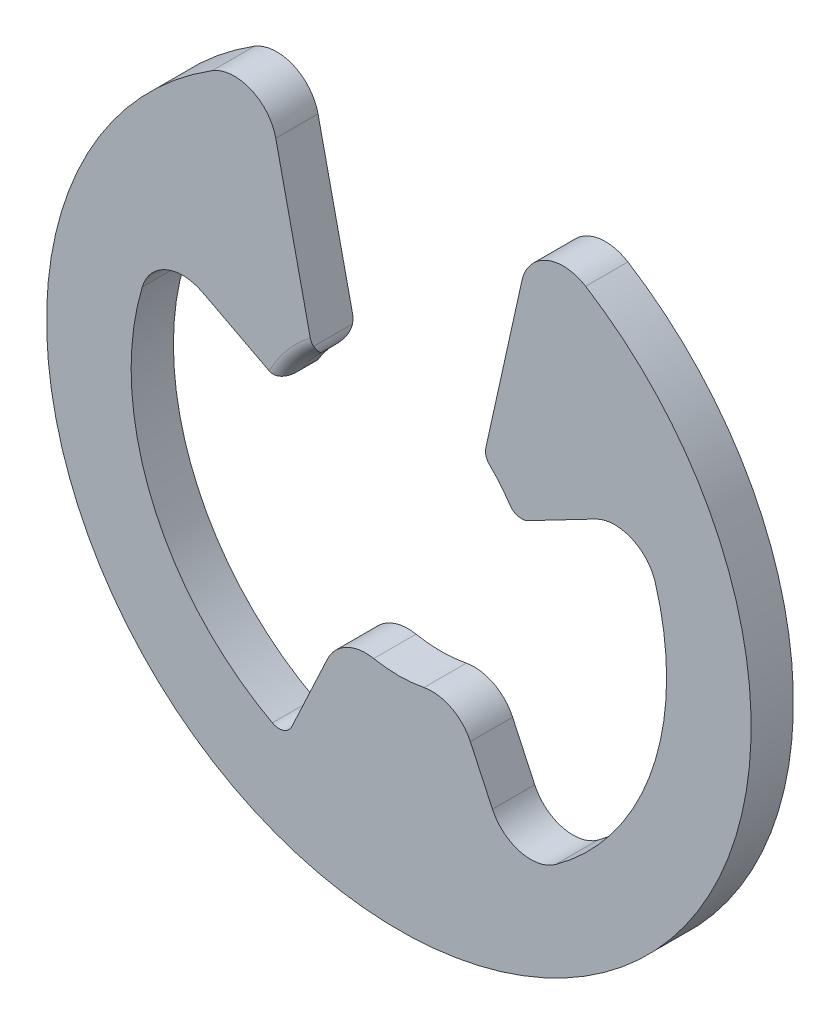
ISO-10303-21;
HEADER;
FILE_DESCRIPTION(('STEP AP214'),'2;1');
FILE_NAME('part.step','',(''),(''),'','','');
FILE_SCHEMA(('AUTOMOTIVE_DESIGN { 1 0 10303 214 1 1 1 1 }'));
ENDSEC;
DATA;
#1=APPLICATION_CONTEXT('core data for automotive mechanical design processes');
#2=APPLICATION_PROTOCOL_DEFINITION('international standard','automotive_design',2000,#1);
#3=PRODUCT_CONTEXT('',#1,'mechanical');
#4=PRODUCT('Part','Part','',(#3));
#5=PRODUCT_RELATED_PRODUCT_CATEGORY('part','',(#4));
#6=PRODUCT_DEFINITION_FORMATION('','',#4);
#7=PRODUCT_DEFINITION_CONTEXT('part definition',#1,'design');
#8=PRODUCT_DEFINITION('design','',#6,#7);
#9=PRODUCT_DEFINITION_SHAPE('','',#8);
#10=(LENGTH_UNIT() NAMED_UNIT(*) SI_UNIT(.MILLI.,.METRE.));
#11=(NAMED_UNIT(*) PLANE_ANGLE_UNIT() SI_UNIT($,.RADIAN.));
#12=(NAMED_UNIT(*) SI_UNIT($,.STERADIAN.) SOLID_ANGLE_UNIT());
#13=UNCERTAINTY_MEASURE_WITH_UNIT(LENGTH_MEASURE(1.E-05),#10,'distance_accuracy_value','');
#14=(GEOMETRIC_REPRESENTATION_CONTEXT(3) GLOBAL_UNCERTAINTY_ASSIGNED_CONTEXT((#13)) GLOBAL_UNIT_ASSIGNED_CONTEXT((#10,
#11,#12)) REPRESENTATION_CONTEXT('',''));
#15=CARTESIAN_POINT('',(0.,0.,0.));
#16=DIRECTION('',(0.,0.,1.));
#17=DIRECTION('',(1.,0.,0.));
#18=AXIS2_PLACEMENT_3D('',#15,#16,#17);
#19=CARTESIAN_POINT('',(0.,0.,0.1905));
#20=DIRECTION('',(0.,0.,1.));
#21=DIRECTION('',(1.,0.,0.));
#22=AXIS2_PLACEMENT_3D('',#19,#20,#21);
#23=PLANE('',#22);
#24=DIRECTION('',(0.216439613938083,0.976296007119938,0.));
#25=VECTOR('',#24,1.);
#26=CARTESIAN_POINT('',(0.635,0.31070010017431,0.1905));
#27=LINE('',#26,#25);
#28=CARTESIAN_POINT('',(0.783751123944975,0.981673059882263,0.1905));
#29=VERTEX_POINT('',#28);
#30=CARTESIAN_POINT('',(1.10956464167249,2.45132286490398,0.1905));
#31=VERTEX_POINT('',#30);
#32=EDGE_CURVE('E562',#29,#31,#27,.T.);
#33=ORIENTED_EDGE('',*,*,#32,.F.);
#34=CARTESIAN_POINT('',(0.907740716849207,0.954185228912126,0.1905));
#35=DIRECTION('',(0.,0.,1.));
#36=DIRECTION('',(1.,0.,0.));
#37=AXIS2_PLACEMENT_3D('',#34,#35,#36);
#38=CIRCLE('',#37,0.127);
#39=CARTESIAN_POINT('',(0.820205450036362,0.862171224195432,0.1905));
#40=VERTEX_POINT('',#39);
#41=EDGE_CURVE('E248',#29,#40,#38,.T.);
#42=ORIENTED_EDGE('',*,*,#41,.T.);
#43=CARTESIAN_POINT('',(0.,0.,0.1905));
#44=DIRECTION('',(0.,0.,1.));
#45=DIRECTION('',(1.,0.,0.));
#46=AXIS2_PLACEMENT_3D('',#43,#44,#45);
#47=CIRCLE('',#46,1.18999);
#48=CARTESIAN_POINT('',(0.998813518757322,0.646875378142975,0.1905));
#49=VERTEX_POINT('',#48);
#50=EDGE_CURVE('E574',#49,#40,#47,.T.);
#51=ORIENTED_EDGE('',*,*,#50,.F.);
#52=CARTESIAN_POINT('',(1.10541047913697,0.715912238136889,0.1905));
#53=DIRECTION('',(0.,0.,1.));
#54=DIRECTION('',(1.,0.,0.));
#55=AXIS2_PLACEMENT_3D('',#52,#53,#54);
#56=CIRCLE('',#55,0.127);
#57=CARTESIAN_POINT('',(1.16405255301782,0.603261862323256,0.1905));
#58=VERTEX_POINT('',#57);
#59=EDGE_CURVE('E271',#49,#58,#56,.T.);
#60=ORIENTED_EDGE('',*,*,#59,.T.);
#61=DIRECTION('',(-0.887010833178209,-0.461748613235057,0.));
#62=VECTOR('',#61,1.);
#63=CARTESIAN_POINT('',(0.00110812508443814,-0.00212868848165393,0.1905));
#64=LINE('',#63,#62);
#65=CARTESIAN_POINT('',(1.77114008936247,0.919291630544937,0.1905));
#66=VERTEX_POINT('',#65);
#67=EDGE_CURVE('E538',#66,#58,#64,.T.);
#68=ORIENTED_EDGE('',*,*,#67,.F.);
#69=CARTESIAN_POINT('',(1.94706631100503,0.581340503104039,0.1905));
#70=DIRECTION('',(0.,0.,1.));
#71=DIRECTION('',(1.,0.,0.));
#72=AXIS2_PLACEMENT_3D('',#69,#70,#71);
#73=CIRCLE('',#72,0.381);
#74=CARTESIAN_POINT('',(2.31214124431847,0.690341847436047,0.1905));
#75=VERTEX_POINT('',#74);
#76=EDGE_CURVE('E517',#66,#75,#73,.F.);
#77=ORIENTED_EDGE('',*,*,#76,.T.);
#78=CARTESIAN_POINT('',(0.,0.,0.1905));
#79=DIRECTION('',(0.,0.,1.));
#80=DIRECTION('',(1.,0.,0.));
#81=AXIS2_PLACEMENT_3D('',#78,#79,#80);
#82=CIRCLE('',#81,2.413);
#83=CARTESIAN_POINT('',(1.4117485190964,-1.95691980388291,0.1905));
#84=VERTEX_POINT('',#83);
#85=EDGE_CURVE('E529',#84,#75,#82,.T.);
#86=ORIENTED_EDGE('',*,*,#85,.F.);
#87=CARTESIAN_POINT('',(1.18884085818644,-1.64793246642771,0.1905));
#88=DIRECTION('',(0.,0.,1.));
#89=DIRECTION('',(1.,0.,0.));
#90=AXIS2_PLACEMENT_3D('',#87,#88,#89);
#91=CIRCLE('',#90,0.381);
#92=CARTESIAN_POINT('',(0.843537591325478,-1.80895002415092,0.1905));
#93=VERTEX_POINT('',#92);
#94=EDGE_CURVE('E56',#84,#93,#91,.F.);
#95=ORIENTED_EDGE('',*,*,#94,.T.);
#96=DIRECTION('',(0.4226182617407,-0.90630778703665,0.));
#97=VECTOR('',#96,1.);
#98=CARTESIAN_POINT('',(8.49472678472959E-06,3.9611561536538E-06,0.1905));
#99=LINE('',#98,#97);
#100=CARTESIAN_POINT('',(0.644117509127735,-1.38129227778927,0.1905));
#101=VERTEX_POINT('',#100);
#102=EDGE_CURVE('E527',#101,#93,#99,.T.);
#103=ORIENTED_EDGE('',*,*,#102,.F.);
#104=CARTESIAN_POINT('',(0.298814242266771,-1.54230983551248,0.1905));
#105=DIRECTION('',(0.,0.,1.));
#106=DIRECTION('',(1.,0.,0.));
#107=AXIS2_PLACEMENT_3D('',#104,#105,#106);
#108=CIRCLE('',#107,0.381);
#109=CARTESIAN_POINT('',(0.226345145516544,-1.16826541299531,0.1905));
#110=VERTEX_POINT('',#109);
#111=EDGE_CURVE('E262',#101,#110,#108,.T.);
#112=ORIENTED_EDGE('',*,*,#111,.T.);
#113=CARTESIAN_POINT('',(-0.226345145516544,-1.16826541299531,0.1905));
#114=VERTEX_POINT('',#113);
#115=EDGE_CURVE('E569',#114,#110,#47,.T.);
#116=ORIENTED_EDGE('',*,*,#115,.F.);
#117=CARTESIAN_POINT('',(-0.298814242266771,-1.54230983551248,0.1905));
#118=DIRECTION('',(0.,0.,1.));
#119=DIRECTION('',(1.,0.,0.));
#120=AXIS2_PLACEMENT_3D('',#117,#118,#119);
#121=CIRCLE('',#120,0.381);
#122=CARTESIAN_POINT('',(-0.644117509127735,-1.38129227778927,0.1905));
#123=VERTEX_POINT('',#122);
#124=EDGE_CURVE('E265',#114,#123,#121,.T.);
#125=ORIENTED_EDGE('',*,*,#124,.T.);
#126=DIRECTION('',(-0.4226182617407,-0.90630778703665,0.));
#127=VECTOR('',#126,1.);
#128=CARTESIAN_POINT('',(-0.50292,-1.07849324230614,0.1905));
#129=LINE('',#128,#127);
#130=CARTESIAN_POINT('',(-0.964621565173909,-2.06861544403168,0.1905));
#131=VERTEX_POINT('',#130);
#132=EDGE_CURVE('E537',#123,#131,#129,.T.);
#133=ORIENTED_EDGE('',*,*,#132,.T.);
#134=CARTESIAN_POINT('',(-1.07972265412756,-2.01494292479061,0.1905));
#135=DIRECTION('',(0.,0.,1.));
#136=DIRECTION('',(1.,0.,0.));
#137=AXIS2_PLACEMENT_3D('',#134,#135,#136);
#138=CIRCLE('',#137,0.127);
#139=CARTESIAN_POINT('',(-1.13970724602354,-2.12688419839009,0.1905));
#140=VERTEX_POINT('',#139);
#141=EDGE_CURVE('E505',#131,#140,#138,.F.);
#142=ORIENTED_EDGE('',*,*,#141,.T.);
#143=CARTESIAN_POINT('',(0.,0.,0.1905));
#144=DIRECTION('',(0.,0.,1.));
#145=DIRECTION('',(1.,0.,0.));
#146=AXIS2_PLACEMENT_3D('',#143,#144,#145);
#147=CIRCLE('',#146,2.413);
#148=CARTESIAN_POINT('',(-2.31214124431847,0.690341847436047,0.1905));
#149=VERTEX_POINT('',#148);
#150=EDGE_CURVE('E565',#149,#140,#147,.T.);
#151=ORIENTED_EDGE('',*,*,#150,.F.);
#152=CARTESIAN_POINT('',(-1.94706631100503,0.581340503104039,0.1905));
#153=DIRECTION('',(0.,0.,1.));
#154=DIRECTION('',(1.,0.,0.));
#155=AXIS2_PLACEMENT_3D('',#152,#153,#154);
#156=CIRCLE('',#155,0.381);
#157=CARTESIAN_POINT('',(-1.77114008936247,0.919291630544937,0.1905));
#158=VERTEX_POINT('',#157);
#159=EDGE_CURVE('E511',#149,#158,#156,.F.);
#160=ORIENTED_EDGE('',*,*,#159,.T.);
#161=DIRECTION('',(0.88701083317821,-0.461748613235058,0.));
#162=VECTOR('',#161,1.);
#163=CARTESIAN_POINT('',(-2.14146420700148,1.11207016421246,0.1905));
#164=LINE('',#163,#162);
#165=CARTESIAN_POINT('',(-1.16929058280128,0.605988608038333,0.1905));
#166=VERTEX_POINT('',#165);
#167=EDGE_CURVE('E587',#158,#166,#164,.T.);
#168=ORIENTED_EDGE('',*,*,#167,.T.);
#169=CARTESIAN_POINT('',(0.,0.,0.1905));
#170=DIRECTION('',(0.,0.,1.));
#171=DIRECTION('',(1.,0.,0.));
#172=AXIS2_PLACEMENT_3D('',#169,#170,#171);
#173=CIRCLE('',#172,1.31699);
#174=CARTESIAN_POINT('',(-0.798331234407467,1.04743968812977,0.1905));
#175=VERTEX_POINT('',#174);
#176=EDGE_CURVE('E268',#166,#175,#173,.F.);
#177=ORIENTED_EDGE('',*,*,#176,.T.);
#178=DIRECTION('',(0.216439613938083,-0.976296007119938,0.));
#179=VECTOR('',#178,1.);
#180=CARTESIAN_POINT('',(-1.27,3.175,0.1905));
#181=LINE('',#180,#179);
#182=CARTESIAN_POINT('',(-1.10956464167249,2.45132286490398,0.1905));
#183=VERTEX_POINT('',#182);
#184=EDGE_CURVE('E245',#183,#175,#181,.T.);
#185=ORIENTED_EDGE('',*,*,#184,.F.);
#186=CARTESIAN_POINT('',(-1.48153342038519,2.36885937199357,0.1905));
#187=DIRECTION('',(0.,0.,1.));
#188=DIRECTION('',(1.,0.,0.));
#189=AXIS2_PLACEMENT_3D('',#186,#187,#188);
#190=CIRCLE('',#189,0.381);
#191=CARTESIAN_POINT('',(-1.68356070498317,2.69188564999269,0.1905));
#192=VERTEX_POINT('',#191);
#193=EDGE_CURVE('E250',#183,#192,#190,.T.);
#194=ORIENTED_EDGE('',*,*,#193,.T.);
#195=CARTESIAN_POINT('',(0.,0.,0.1905));
#196=DIRECTION('',(0.,0.,1.));
#197=DIRECTION('',(1.,0.,0.));
#198=AXIS2_PLACEMENT_3D('',#195,#196,#197);
#199=CIRCLE('',#198,3.175);
#200=CARTESIAN_POINT('',(1.68356070498317,2.69188564999269,0.1905));
#201=VERTEX_POINT('',#200);
#202=EDGE_CURVE('E256',#192,#201,#199,.T.);
#203=ORIENTED_EDGE('',*,*,#202,.T.);
#204=CARTESIAN_POINT('',(1.48153342038519,2.36885937199357,0.1905));
#205=DIRECTION('',(0.,0.,1.));
#206=DIRECTION('',(1.,0.,0.));
#207=AXIS2_PLACEMENT_3D('',#204,#205,#206);
#208=CIRCLE('',#207,0.381);
#209=EDGE_CURVE('E254',#201,#31,#208,.T.);
#210=ORIENTED_EDGE('',*,*,#209,.T.);
#211=EDGE_LOOP('',(#33,#42,#51,#60,#68,#77,#86,#95,#103,#112,#116,#125,#133,#142,#151,#160,#168,
#177,#185,#194,#203,#210));
#212=FACE_BOUND('',#211,.T.);
#213=ADVANCED_FACE('F40',(#212),#23,.T.);
#214=CARTESIAN_POINT('',(0.,0.,-0.1905));
#215=DIRECTION('',(0.,0.,1.));
#216=DIRECTION('',(1.,0.,0.));
#217=AXIS2_PLACEMENT_3D('',#214,#215,#216);
#218=PLANE('',#217);
#219=CARTESIAN_POINT('',(0.,0.,-0.1905));
#220=DIRECTION('',(0.,0.,1.));
#221=DIRECTION('',(1.,0.,0.));
#222=AXIS2_PLACEMENT_3D('',#219,#220,#221);
#223=CIRCLE('',#222,1.18999);
#224=CARTESIAN_POINT('',(0.998813518757322,0.646875378142975,-0.1905));
#225=VERTEX_POINT('',#224);
#226=CARTESIAN_POINT('',(0.820205450036362,0.862171224195432,-0.1905));
#227=VERTEX_POINT('',#226);
#228=EDGE_CURVE('E227',#225,#227,#223,.T.);
#229=ORIENTED_EDGE('',*,*,#228,.T.);
#230=CARTESIAN_POINT('',(0.907740716849207,0.954185228912126,-0.1905));
#231=DIRECTION('',(0.,0.,1.));
#232=DIRECTION('',(1.,0.,0.));
#233=AXIS2_PLACEMENT_3D('',#230,#231,#232);
#234=CIRCLE('',#233,0.127);
#235=CARTESIAN_POINT('',(0.783751123944975,0.981673059882263,-0.1905));
#236=VERTEX_POINT('',#235);
#237=EDGE_CURVE('E221',#227,#236,#234,.F.);
#238=ORIENTED_EDGE('',*,*,#237,.T.);
#239=DIRECTION('',(0.216439613938083,0.976296007119938,0.));
#240=VECTOR('',#239,1.);
#241=CARTESIAN_POINT('',(0.635,0.31070010017431,-0.1905));
#242=LINE('',#241,#240);
#243=CARTESIAN_POINT('',(1.10956464167249,2.45132286490398,-0.1905));
#244=VERTEX_POINT('',#243);
#245=EDGE_CURVE('E224',#236,#244,#242,.T.);
#246=ORIENTED_EDGE('',*,*,#245,.T.);
#247=CARTESIAN_POINT('',(1.48153342038519,2.36885937199357,-0.1905));
#248=DIRECTION('',(0.,0.,1.));
#249=DIRECTION('',(1.,0.,0.));
#250=AXIS2_PLACEMENT_3D('',#247,#248,#249);
#251=CIRCLE('',#250,0.381);
#252=CARTESIAN_POINT('',(1.68356070498317,2.69188564999269,-0.1905));
#253=VERTEX_POINT('',#252);
#254=EDGE_CURVE('E286',#244,#253,#251,.F.);
#255=ORIENTED_EDGE('',*,*,#254,.T.);
#256=CARTESIAN_POINT('',(0.,0.,-0.1905));
#257=DIRECTION('',(0.,0.,1.));
#258=DIRECTION('',(1.,0.,0.));
#259=AXIS2_PLACEMENT_3D('',#256,#257,#258);
#260=CIRCLE('',#259,3.175);
#261=CARTESIAN_POINT('',(-1.68356070498317,2.69188564999269,-0.1905));
#262=VERTEX_POINT('',#261);
#263=EDGE_CURVE('E573',#262,#253,#260,.T.);
#264=ORIENTED_EDGE('',*,*,#263,.F.);
#265=CARTESIAN_POINT('',(-1.48153342038519,2.36885937199357,-0.1905));
#266=DIRECTION('',(0.,0.,1.));
#267=DIRECTION('',(1.,0.,0.));
#268=AXIS2_PLACEMENT_3D('',#265,#266,#267);
#269=CIRCLE('',#268,0.381);
#270=CARTESIAN_POINT('',(-1.10956464167249,2.45132286490398,-0.1905));
#271=VERTEX_POINT('',#270);
#272=EDGE_CURVE('E283',#262,#271,#269,.F.);
#273=ORIENTED_EDGE('',*,*,#272,.T.);
#274=DIRECTION('',(0.216439613938083,-0.976296007119938,0.));
#275=VECTOR('',#274,1.);
#276=CARTESIAN_POINT('',(-1.27,3.175,-0.1905));
#277=LINE('',#276,#275);
#278=CARTESIAN_POINT('',(-0.798331234407472,1.04743968812979,-0.1905));
#279=VERTEX_POINT('',#278);
#280=EDGE_CURVE('E244',#271,#279,#277,.T.);
#281=ORIENTED_EDGE('',*,*,#280,.T.);
#282=CARTESIAN_POINT('',(0.,0.,-0.1905));
#283=DIRECTION('',(0.,0.,1.));
#284=DIRECTION('',(1.,0.,0.));
#285=AXIS2_PLACEMENT_3D('',#282,#283,#284);
#286=CIRCLE('',#285,1.31699);
#287=CARTESIAN_POINT('',(-1.16929058280128,0.605988608038333,-0.1905));
#288=VERTEX_POINT('',#287);
#289=EDGE_CURVE('E295',#279,#288,#286,.T.);
#290=ORIENTED_EDGE('',*,*,#289,.T.);
#291=DIRECTION('',(0.88701083317821,-0.461748613235057,0.));
#292=VECTOR('',#291,1.);
#293=CARTESIAN_POINT('',(-0.00110812508443814,-0.00212868848165393,-0.1905));
#294=LINE('',#293,#292);
#295=CARTESIAN_POINT('',(-1.77114008936247,0.919291630544937,-0.1905));
#296=VERTEX_POINT('',#295);
#297=EDGE_CURVE('E554',#296,#288,#294,.T.);
#298=ORIENTED_EDGE('',*,*,#297,.F.);
#299=CARTESIAN_POINT('',(-1.94706631100503,0.581340503104039,-0.1905));
#300=DIRECTION('',(0.,0.,1.));
#301=DIRECTION('',(1.,0.,0.));
#302=AXIS2_PLACEMENT_3D('',#299,#300,#301);
#303=CIRCLE('',#302,0.381);
#304=CARTESIAN_POINT('',(-2.31214124431847,0.690341847436047,-0.1905));
#305=VERTEX_POINT('',#304);
#306=EDGE_CURVE('E514',#296,#305,#303,.T.);
#307=ORIENTED_EDGE('',*,*,#306,.T.);
#308=CARTESIAN_POINT('',(0.,0.,-0.1905));
#309=DIRECTION('',(0.,0.,1.));
#310=DIRECTION('',(1.,0.,0.));
#311=AXIS2_PLACEMENT_3D('',#308,#309,#310);
#312=CIRCLE('',#311,2.413);
#313=CARTESIAN_POINT('',(-1.13970724602354,-2.12688419839009,-0.1905));
#314=VERTEX_POINT('',#313);
#315=EDGE_CURVE('E812',#305,#314,#312,.T.);
#316=ORIENTED_EDGE('',*,*,#315,.T.);
#317=CARTESIAN_POINT('',(-1.07972265412756,-2.01494292479061,-0.1905));
#318=DIRECTION('',(0.,0.,1.));
#319=DIRECTION('',(1.,0.,0.));
#320=AXIS2_PLACEMENT_3D('',#317,#318,#319);
#321=CIRCLE('',#320,0.127);
#322=CARTESIAN_POINT('',(-0.964621565173909,-2.06861544403168,-0.1905));
#323=VERTEX_POINT('',#322);
#324=EDGE_CURVE('E508',#314,#323,#321,.T.);
#325=ORIENTED_EDGE('',*,*,#324,.T.);
#326=DIRECTION('',(-0.4226182617407,-0.90630778703665,0.));
#327=VECTOR('',#326,1.);
#328=CARTESIAN_POINT('',(-8.49472678472959E-06,3.9611561536538E-06,-0.1905));
#329=LINE('',#328,#327);
#330=CARTESIAN_POINT('',(-0.644117509127735,-1.38129227778927,-0.1905));
#331=VERTEX_POINT('',#330);
#332=EDGE_CURVE('E590',#331,#323,#329,.T.);
#333=ORIENTED_EDGE('',*,*,#332,.F.);
#334=CARTESIAN_POINT('',(-0.298814242266771,-1.54230983551248,-0.1905));
#335=DIRECTION('',(0.,0.,1.));
#336=DIRECTION('',(1.,0.,0.));
#337=AXIS2_PLACEMENT_3D('',#334,#335,#336);
#338=CIRCLE('',#337,0.381);
#339=CARTESIAN_POINT('',(-0.226345145516544,-1.16826541299531,-0.1905));
#340=VERTEX_POINT('',#339);
#341=EDGE_CURVE('E292',#331,#340,#338,.F.);
#342=ORIENTED_EDGE('',*,*,#341,.T.);
#343=CARTESIAN_POINT('',(0.226345145516544,-1.16826541299531,-0.1905));
#344=VERTEX_POINT('',#343);
#345=EDGE_CURVE('E575',#340,#344,#223,.T.);
#346=ORIENTED_EDGE('',*,*,#345,.T.);
#347=CARTESIAN_POINT('',(0.298814242266771,-1.54230983551248,-0.1905));
#348=DIRECTION('',(0.,0.,1.));
#349=DIRECTION('',(1.,0.,0.));
#350=AXIS2_PLACEMENT_3D('',#347,#348,#349);
#351=CIRCLE('',#350,0.381);
#352=CARTESIAN_POINT('',(0.644117509127735,-1.38129227778927,-0.1905));
#353=VERTEX_POINT('',#352);
#354=EDGE_CURVE('E289',#344,#353,#351,.F.);
#355=ORIENTED_EDGE('',*,*,#354,.T.);
#356=DIRECTION('',(0.4226182617407,-0.90630778703665,0.));
#357=VECTOR('',#356,1.);
#358=CARTESIAN_POINT('',(8.49472678472959E-06,3.9611561536538E-06,-0.1905));
#359=LINE('',#358,#357);
#360=CARTESIAN_POINT('',(0.843537591325479,-1.80895002415092,-0.1905));
#361=VERTEX_POINT('',#360);
#362=EDGE_CURVE('E545',#353,#361,#359,.T.);
#363=ORIENTED_EDGE('',*,*,#362,.T.);
#364=CARTESIAN_POINT('',(1.18884085818644,-1.64793246642771,-0.1905));
#365=DIRECTION('',(0.,0.,1.));
#366=DIRECTION('',(1.,0.,0.));
#367=AXIS2_PLACEMENT_3D('',#364,#365,#366);
#368=CIRCLE('',#367,0.381);
#369=CARTESIAN_POINT('',(1.4117485190964,-1.95691980388291,-0.1905));
#370=VERTEX_POINT('',#369);
#371=EDGE_CURVE('E12',#361,#370,#368,.T.);
#372=ORIENTED_EDGE('',*,*,#371,.T.);
#373=CARTESIAN_POINT('',(0.,0.,-0.1905));
#374=DIRECTION('',(0.,0.,1.));
#375=DIRECTION('',(1.,0.,0.));
#376=AXIS2_PLACEMENT_3D('',#373,#374,#375);
#377=CIRCLE('',#376,2.413);
#378=CARTESIAN_POINT('',(2.31214124431847,0.690341847436047,-0.1905));
#379=VERTEX_POINT('',#378);
#380=EDGE_CURVE('E543',#370,#379,#377,.T.);
#381=ORIENTED_EDGE('',*,*,#380,.T.);
#382=CARTESIAN_POINT('',(1.94706631100503,0.581340503104039,-0.1905));
#383=DIRECTION('',(0.,0.,1.));
#384=DIRECTION('',(1.,0.,0.));
#385=AXIS2_PLACEMENT_3D('',#382,#383,#384);
#386=CIRCLE('',#385,0.381);
#387=CARTESIAN_POINT('',(1.77114008936247,0.919291630544937,-0.1905));
#388=VERTEX_POINT('',#387);
#389=EDGE_CURVE('E520',#379,#388,#386,.T.);
#390=ORIENTED_EDGE('',*,*,#389,.T.);
#391=DIRECTION('',(-0.88701083317821,-0.461748613235057,0.));
#392=VECTOR('',#391,1.);
#393=CARTESIAN_POINT('',(0.00110812508443814,-0.00212868848165393,-0.1905));
#394=LINE('',#393,#392);
#395=CARTESIAN_POINT('',(1.16405255301782,0.603261862323256,-0.1905));
#396=VERTEX_POINT('',#395);
#397=EDGE_CURVE('E549',#388,#396,#394,.T.);
#398=ORIENTED_EDGE('',*,*,#397,.T.);
#399=CARTESIAN_POINT('',(1.10541047913697,0.715912238136889,-0.1905));
#400=DIRECTION('',(0.,0.,1.));
#401=DIRECTION('',(1.,0.,0.));
#402=AXIS2_PLACEMENT_3D('',#399,#400,#401);
#403=CIRCLE('',#402,0.127);
#404=EDGE_CURVE('E233',#396,#225,#403,.F.);
#405=ORIENTED_EDGE('',*,*,#404,.T.);
#406=EDGE_LOOP('',(#229,#238,#246,#255,#264,#273,#281,#290,#298,#307,#316,#325,#333,#342,#346,
#355,#363,#372,#381,#390,#398,#405));
#407=FACE_BOUND('',#406,.T.);
#408=ADVANCED_FACE('F223',(#407),#218,.F.);
#409=CARTESIAN_POINT('',(0.,0.,0.1905));
#410=DIRECTION('',(0.,0.,-1.));
#411=DIRECTION('',(-1.,0.,0.));
#412=AXIS2_PLACEMENT_3D('',#409,#410,#411);
#413=CYLINDRICAL_SURFACE('',#412,1.18999);
#414=CARTESIAN_POINT('',(0.,0.,-0.0635));
#415=DIRECTION('',(0.,0.,1.));
#416=DIRECTION('',(1.,0.,0.));
#417=AXIS2_PLACEMENT_3D('',#414,#415,#416);
#418=CIRCLE('',#417,1.18999);
#419=CARTESIAN_POINT('',(-0.998813518757322,0.646875378142975,-0.0635));
#420=VERTEX_POINT('',#419);
#421=CARTESIAN_POINT('',(-0.820205450036362,0.862171224195432,-0.0635));
#422=VERTEX_POINT('',#421);
#423=EDGE_CURVE('E796',#420,#422,#418,.F.);
#424=ORIENTED_EDGE('',*,*,#423,.T.);
#425=DIRECTION('',(0.,0.,-1.));
#426=VECTOR('',#425,1.);
#427=CARTESIAN_POINT('',(-0.820205450036362,0.862171224195431,0.1905));
#428=LINE('',#427,#426);
#429=CARTESIAN_POINT('',(-0.820205450036362,0.862171224195432,0.0635));
#430=VERTEX_POINT('',#429);
#431=EDGE_CURVE('E789',#422,#430,#428,.F.);
#432=ORIENTED_EDGE('',*,*,#431,.T.);
#433=CARTESIAN_POINT('',(0.,0.,0.0635));
#434=DIRECTION('',(0.,0.,1.));
#435=DIRECTION('',(1.,0.,0.));
#436=AXIS2_PLACEMENT_3D('',#433,#434,#435);
#437=CIRCLE('',#436,1.18999);
#438=CARTESIAN_POINT('',(-0.998813518757322,0.646875378142975,0.0635));
#439=VERTEX_POINT('',#438);
#440=EDGE_CURVE('E341',#430,#439,#437,.T.);
#441=ORIENTED_EDGE('',*,*,#440,.T.);
#442=DIRECTION('',(0.,0.,-1.));
#443=VECTOR('',#442,1.);
#444=CARTESIAN_POINT('',(-0.998813518757322,0.646875378142974,0.1905));
#445=LINE('',#444,#443);
#446=EDGE_CURVE('E794',#439,#420,#445,.T.);
#447=ORIENTED_EDGE('',*,*,#446,.T.);
#448=EDGE_LOOP('',(#424,#432,#441,#447));
#449=FACE_BOUND('',#448,.T.);
#450=ADVANCED_FACE('F417',(#449),#413,.F.);
#451=ORIENTED_EDGE('',*,*,#345,.F.);
#452=DIRECTION('',(0.,0.,-1.));
#453=VECTOR('',#452,1.);
#454=CARTESIAN_POINT('',(-0.226345145516544,-1.16826541299531,0.1905));
#455=LINE('',#454,#453);
#456=EDGE_CURVE('E486',#340,#114,#455,.F.);
#457=ORIENTED_EDGE('',*,*,#456,.T.);
#458=ORIENTED_EDGE('',*,*,#115,.T.);
#459=DIRECTION('',(0.,0.,-1.));
#460=VECTOR('',#459,1.);
#461=CARTESIAN_POINT('',(0.226345145516544,-1.16826541299531,0.1905));
#462=LINE('',#461,#460);
#463=EDGE_CURVE('E483',#110,#344,#462,.T.);
#464=ORIENTED_EDGE('',*,*,#463,.T.);
#465=EDGE_LOOP('',(#451,#457,#458,#464));
#466=FACE_BOUND('',#465,.T.);
#467=ADVANCED_FACE('F422',(#466),#413,.F.);
#468=CARTESIAN_POINT('',(0.,0.,0.1905));
#469=DIRECTION('',(0.,0.,-1.));
#470=DIRECTION('',(-1.,0.,0.));
#471=AXIS2_PLACEMENT_3D('',#468,#469,#470);
#472=CYLINDRICAL_SURFACE('',#471,3.175);
#473=ORIENTED_EDGE('',*,*,#263,.T.);
#474=DIRECTION('',(0.,0.,-1.));
#475=VECTOR('',#474,1.);
#476=CARTESIAN_POINT('',(1.68356070498317,2.69188564999269,0.1905));
#477=LINE('',#476,#475);
#478=EDGE_CURVE('E501',#253,#201,#477,.F.);
#479=ORIENTED_EDGE('',*,*,#478,.T.);
#480=ORIENTED_EDGE('',*,*,#202,.F.);
#481=DIRECTION('',(0.,0.,-1.));
#482=VECTOR('',#481,1.);
#483=CARTESIAN_POINT('',(-1.68356070498317,2.69188564999269,0.1905));
#484=LINE('',#483,#482);
#485=EDGE_CURVE('E497',#192,#262,#484,.T.);
#486=ORIENTED_EDGE('',*,*,#485,.T.);
#487=EDGE_LOOP('',(#473,#479,#480,#486));
#488=FACE_BOUND('',#487,.T.);
#489=ADVANCED_FACE('F420',(#488),#472,.T.);
#490=ORIENTED_EDGE('',*,*,#50,.T.);
#491=DIRECTION('',(0.,0.,-1.));
#492=VECTOR('',#491,1.);
#493=CARTESIAN_POINT('',(0.820205450036361,0.862171224195432,0.1905));
#494=LINE('',#493,#492);
#495=EDGE_CURVE('E280',#40,#227,#494,.T.);
#496=ORIENTED_EDGE('',*,*,#495,.T.);
#497=ORIENTED_EDGE('',*,*,#228,.F.);
#498=DIRECTION('',(0.,0.,-1.));
#499=VECTOR('',#498,1.);
#500=CARTESIAN_POINT('',(0.998813518757322,0.646875378142974,0.1905));
#501=LINE('',#500,#499);
#502=EDGE_CURVE('E276',#225,#49,#501,.F.);
#503=ORIENTED_EDGE('',*,*,#502,.T.);
#504=EDGE_LOOP('',(#490,#496,#497,#503));
#505=FACE_BOUND('',#504,.T.);
#506=ADVANCED_FACE('F327',(#505),#413,.F.);
#507=CARTESIAN_POINT('',(-1.27,3.175,-0.1905));
#508=DIRECTION('',(-0.976296007119938,-0.216439613938083,0.));
#509=DIRECTION('',(0.216439613938083,-0.976296007119938,0.));
#510=AXIS2_PLACEMENT_3D('',#507,#508,#509);
#511=PLANE('',#510);
#512=DIRECTION('',(0.,0.,1.));
#513=VECTOR('',#512,1.);
#514=CARTESIAN_POINT('',(-0.783751123944975,0.981673059882263,-0.1905));
#515=LINE('',#514,#513);
#516=CARTESIAN_POINT('',(-0.783751123944975,0.981673059882263,0.174986274012193));
#517=VERTEX_POINT('',#516);
#518=CARTESIAN_POINT('',(-0.783751123944975,0.981673059882263,-0.174986274012193));
#519=VERTEX_POINT('',#518);
#520=EDGE_CURVE('E317',#517,#519,#515,.F.);
#521=ORIENTED_EDGE('',*,*,#520,.T.);
#522=CARTESIAN_POINT('',(-0.783751123944975,0.981673059882263,-0.174986274012193));
#523=CARTESIAN_POINT('',(-0.785439758907732,0.989289999968355,-0.178812168659377));
#524=CARTESIAN_POINT('',(-0.787200545467286,0.997232394875668,-0.181945979791769));
#525=CARTESIAN_POINT('',(-0.790777927633256,1.01336892303256,-0.186749618933024));
#526=CARTESIAN_POINT('',(-0.792592875423646,1.02155562346437,-0.188445599585439));
#527=CARTESIAN_POINT('',(-0.795721528665629,1.035668066248,-0.190146995064709));
#528=CARTESIAN_POINT('',(-0.797026696940758,1.04155529988533,-0.19050163699213));
#529=CARTESIAN_POINT('',(-0.798331234407472,1.04743968812979,-0.1905));
#530=B_SPLINE_CURVE_WITH_KNOTS('',3,(#522,#523,#524,#525,#526,#527,#528,#529),.UNSPECIFIED.,.F.,
.F.,(4,2,2,4),(0.,0.0260292950500792,0.0515743151854442,0.0696533263747294),.UNSPECIFIED.);
#531=EDGE_CURVE('E333',#519,#279,#530,.T.);
#532=ORIENTED_EDGE('',*,*,#531,.T.);
#533=ORIENTED_EDGE('',*,*,#280,.F.);
#534=DIRECTION('',(0.,0.,-1.));
#535=VECTOR('',#534,1.);
#536=CARTESIAN_POINT('',(-1.10956464167249,2.45132286490398,-0.1905));
#537=LINE('',#536,#535);
#538=EDGE_CURVE('E306',#271,#183,#537,.F.);
#539=ORIENTED_EDGE('',*,*,#538,.T.);
#540=ORIENTED_EDGE('',*,*,#184,.T.);
#541=CARTESIAN_POINT('',(-0.798331234407528,1.04743968812975,0.1905));
#542=CARTESIAN_POINT('',(-0.794501737133151,1.03016594220964,0.190417979544793));
#543=CARTESIAN_POINT('',(-0.790845388049622,1.0136732173063,0.187566404954504));
#544=CARTESIAN_POINT('',(-0.786137079930131,0.99243541183388,0.179968219597475));
#545=CARTESIAN_POINT('',(-0.784933392192809,0.987005927321388,0.177648552191829));
#546=CARTESIAN_POINT('',(-0.783751123944975,0.981673059882262,0.174986274012196));
#547=B_SPLINE_CURVE_WITH_KNOTS('',3,(#541,#542,#543,#544,#545,#546),.UNSPECIFIED.,.F.,.F.,(4,2,
4),(0.,0.0513964305085103,0.0694735212041577),.UNSPECIFIED.);
#548=EDGE_CURVE('E309',#175,#517,#547,.T.);
#549=ORIENTED_EDGE('',*,*,#548,.T.);
#550=EDGE_LOOP('',(#521,#532,#533,#539,#540,#549));
#551=FACE_BOUND('',#550,.T.);
#552=ADVANCED_FACE('F322',(#551),#511,.F.);
#553=CARTESIAN_POINT('',(0.635,0.31070010017431,-0.1905));
#554=DIRECTION('',(0.976296007119938,-0.216439613938083,0.));
#555=DIRECTION('',(0.216439613938083,0.976296007119938,0.));
#556=AXIS2_PLACEMENT_3D('',#553,#554,#555);
#557=PLANE('',#556);
#558=ORIENTED_EDGE('',*,*,#245,.F.);
#559=DIRECTION('',(0.,0.,1.));
#560=VECTOR('',#559,1.);
#561=CARTESIAN_POINT('',(0.783751123944975,0.981673059882263,0.1905));
#562=LINE('',#561,#560);
#563=EDGE_CURVE('E239',#236,#29,#562,.T.);
#564=ORIENTED_EDGE('',*,*,#563,.T.);
#565=ORIENTED_EDGE('',*,*,#32,.T.);
#566=DIRECTION('',(0.,0.,-1.));
#567=VECTOR('',#566,1.);
#568=CARTESIAN_POINT('',(1.10956464167249,2.45132286490398,-0.1905));
#569=LINE('',#568,#567);
#570=EDGE_CURVE('E242',#31,#244,#569,.T.);
#571=ORIENTED_EDGE('',*,*,#570,.T.);
#572=EDGE_LOOP('',(#558,#564,#565,#571));
#573=FACE_BOUND('',#572,.T.);
#574=ADVANCED_FACE('F237',(#573),#557,.F.);
#575=CARTESIAN_POINT('',(8.49472678472959E-06,3.9611561536538E-06,-0.1905));
#576=DIRECTION('',(-0.90630778703665,-0.4226182617407,0.));
#577=DIRECTION('',(0.4226182617407,-0.90630778703665,0.));
#578=AXIS2_PLACEMENT_3D('',#575,#576,#577);
#579=PLANE('',#578);
#580=ORIENTED_EDGE('',*,*,#362,.F.);
#581=DIRECTION('',(0.,0.,1.));
#582=VECTOR('',#581,1.);
#583=CARTESIAN_POINT('',(0.644117509127735,-1.38129227778927,0.1905));
#584=LINE('',#583,#582);
#585=EDGE_CURVE('E493',#353,#101,#584,.T.);
#586=ORIENTED_EDGE('',*,*,#585,.T.);
#587=ORIENTED_EDGE('',*,*,#102,.T.);
#588=DIRECTION('',(0.,0.,-1.));
#589=VECTOR('',#588,1.);
#590=CARTESIAN_POINT('',(0.843537591325478,-1.80895002415092,-0.1905));
#591=LINE('',#590,#589);
#592=EDGE_CURVE('E490',#93,#361,#591,.T.);
#593=ORIENTED_EDGE('',*,*,#592,.T.);
#594=EDGE_LOOP('',(#580,#586,#587,#593));
#595=FACE_BOUND('',#594,.T.);
#596=ADVANCED_FACE('F329',(#595),#579,.F.);
#597=CARTESIAN_POINT('',(0.00110812508443814,-0.00212868848165393,-0.1905));
#598=DIRECTION('',(-0.461748613235057,0.887010833178209,0.));
#599=DIRECTION('',(-0.887010833178209,-0.461748613235057,0.));
#600=AXIS2_PLACEMENT_3D('',#597,#598,#599);
#601=PLANE('',#600);
#602=ORIENTED_EDGE('',*,*,#67,.T.);
#603=DIRECTION('',(0.,0.,1.));
#604=VECTOR('',#603,1.);
#605=CARTESIAN_POINT('',(1.16405255301782,0.603261862323256,-0.1905));
#606=LINE('',#605,#604);
#607=EDGE_CURVE('E303',#58,#396,#606,.F.);
#608=ORIENTED_EDGE('',*,*,#607,.T.);
#609=ORIENTED_EDGE('',*,*,#397,.F.);
#610=DIRECTION('',(0.,0.,-1.));
#611=VECTOR('',#610,1.);
#612=CARTESIAN_POINT('',(1.77114008936247,0.919291630544937,0.1905));
#613=LINE('',#612,#611);
#614=EDGE_CURVE('E232',#388,#66,#613,.F.);
#615=ORIENTED_EDGE('',*,*,#614,.T.);
#616=EDGE_LOOP('',(#602,#608,#609,#615));
#617=FACE_BOUND('',#616,.T.);
#618=ADVANCED_FACE('F446',(#617),#601,.F.);
#619=CARTESIAN_POINT('',(0.,0.,-0.1905));
#620=DIRECTION('',(0.,0.,1.));
#621=DIRECTION('',(1.,0.,0.));
#622=AXIS2_PLACEMENT_3D('',#619,#620,#621);
#623=CYLINDRICAL_SURFACE('',#622,2.413);
#624=ORIENTED_EDGE('',*,*,#85,.T.);
#625=DIRECTION('',(0.,0.,1.));
#626=VECTOR('',#625,1.);
#627=CARTESIAN_POINT('',(2.31214124431847,0.690341847436047,-0.1905));
#628=LINE('',#627,#626);
#629=EDGE_CURVE('E480',#75,#379,#628,.F.);
#630=ORIENTED_EDGE('',*,*,#629,.T.);
#631=ORIENTED_EDGE('',*,*,#380,.F.);
#632=DIRECTION('',(0.,0.,1.));
#633=VECTOR('',#632,1.);
#634=CARTESIAN_POINT('',(1.4117485190964,-1.95691980388291,-0.1905));
#635=LINE('',#634,#633);
#636=EDGE_CURVE('E476',#370,#84,#635,.T.);
#637=ORIENTED_EDGE('',*,*,#636,.T.);
#638=EDGE_LOOP('',(#624,#630,#631,#637));
#639=FACE_BOUND('',#638,.T.);
#640=ADVANCED_FACE('F445',(#639),#623,.F.);
#641=CARTESIAN_POINT('',(-0.00110812508443814,-0.00212868848165393,-0.1905));
#642=DIRECTION('',(-0.461748613235057,-0.887010833178209,0.));
#643=DIRECTION('',(0.887010833178209,-0.461748613235057,0.));
#644=AXIS2_PLACEMENT_3D('',#641,#642,#643);
#645=PLANE('',#644);
#646=ORIENTED_EDGE('',*,*,#297,.T.);
#647=CARTESIAN_POINT('',(-1.16929058280128,0.605988608038333,-0.1905));
#648=CARTESIAN_POINT('',(-1.16841710551818,0.605533904545346,-0.190499996903676));
#649=CARTESIAN_POINT('',(-1.16754386439468,0.605079323989263,-0.190488548225858));
#650=CARTESIAN_POINT('',(-1.16579785446686,0.604170408750904,-0.190442759707237));
#651=CARTESIAN_POINT('',(-1.16492508566254,0.603716074068628,-0.190408419866433));
#652=CARTESIAN_POINT('',(-1.16405255301782,0.603261862323256,-0.190362634444137));
#653=B_SPLINE_CURVE_WITH_KNOTS('',3,(#647,#648,#649,#650,#651,#652),.UNSPECIFIED.,.F.,.F.,(4,2,
4),(0.,0.00295362853550676,0.00590725707100732),.UNSPECIFIED.);
#654=CARTESIAN_POINT('',(-1.16405255301782,0.603261862323256,-0.190362634444137));
#655=VERTEX_POINT('',#654);
#656=EDGE_CURVE('E64',#288,#655,#653,.T.);
#657=ORIENTED_EDGE('',*,*,#656,.T.);
#658=DIRECTION('',(0.,0.,-1.));
#659=VECTOR('',#658,1.);
#660=CARTESIAN_POINT('',(-1.16405255301782,0.603261862323256,-0.1905));
#661=LINE('',#660,#659);
#662=CARTESIAN_POINT('',(-1.16405255301782,0.603261862323256,0.190362634444137));
#663=VERTEX_POINT('',#662);
#664=EDGE_CURVE('E68',#655,#663,#661,.F.);
#665=ORIENTED_EDGE('',*,*,#664,.T.);
#666=CARTESIAN_POINT('',(-1.16405255301782,0.603261862323256,0.190362634444137));
#667=CARTESIAN_POINT('',(-1.16492508566254,0.603716074068628,0.190408419866433));
#668=CARTESIAN_POINT('',(-1.16579785446686,0.604170408750903,0.190442759707237));
#669=CARTESIAN_POINT('',(-1.16754386439468,0.605079323989263,0.190488548225858));
#670=CARTESIAN_POINT('',(-1.16841710551818,0.605533904545346,0.190499996903676));
#671=CARTESIAN_POINT('',(-1.16929058280128,0.605988608038333,0.1905));
#672=B_SPLINE_CURVE_WITH_KNOTS('',3,(#666,#667,#668,#669,#670,#671),.UNSPECIFIED.,.F.,.F.,(4,2,
4),(0.,0.00295362853550051,0.00590725707100702),.UNSPECIFIED.);
#673=EDGE_CURVE('E449',#663,#166,#672,.T.);
#674=ORIENTED_EDGE('',*,*,#673,.T.);
#675=ORIENTED_EDGE('',*,*,#167,.F.);
#676=DIRECTION('',(0.,0.,1.));
#677=VECTOR('',#676,1.);
#678=CARTESIAN_POINT('',(-1.77114008936247,0.919291630544937,-0.1905));
#679=LINE('',#678,#677);
#680=EDGE_CURVE('E798',#158,#296,#679,.F.);
#681=ORIENTED_EDGE('',*,*,#680,.T.);
#682=EDGE_LOOP('',(#646,#657,#665,#674,#675,#681));
#683=FACE_BOUND('',#682,.T.);
#684=ADVANCED_FACE('F437',(#683),#645,.T.);
#685=CARTESIAN_POINT('',(-8.49472678472959E-06,3.9611561536538E-06,-0.1905));
#686=DIRECTION('',(-0.90630778703665,0.4226182617407,0.));
#687=DIRECTION('',(-0.4226182617407,-0.90630778703665,0.));
#688=AXIS2_PLACEMENT_3D('',#685,#686,#687);
#689=PLANE('',#688);
#690=ORIENTED_EDGE('',*,*,#332,.T.);
#691=DIRECTION('',(0.,0.,1.));
#692=VECTOR('',#691,1.);
#693=CARTESIAN_POINT('',(-0.964621565173909,-2.06861544403168,-0.1905));
#694=LINE('',#693,#692);
#695=EDGE_CURVE('E465',#323,#131,#694,.T.);
#696=ORIENTED_EDGE('',*,*,#695,.T.);
#697=ORIENTED_EDGE('',*,*,#132,.F.);
#698=DIRECTION('',(0.,0.,-1.));
#699=VECTOR('',#698,1.);
#700=CARTESIAN_POINT('',(-0.644117509127735,-1.38129227778927,-0.1905));
#701=LINE('',#700,#699);
#702=EDGE_CURVE('E462',#123,#331,#701,.T.);
#703=ORIENTED_EDGE('',*,*,#702,.T.);
#704=EDGE_LOOP('',(#690,#696,#697,#703));
#705=FACE_BOUND('',#704,.T.);
#706=ADVANCED_FACE('F431',(#705),#689,.T.);
#707=CARTESIAN_POINT('',(0.,0.,-0.1905));
#708=DIRECTION('',(0.,0.,1.));
#709=DIRECTION('',(1.,0.,0.));
#710=AXIS2_PLACEMENT_3D('',#707,#708,#709);
#711=CYLINDRICAL_SURFACE('',#710,2.413);
#712=ORIENTED_EDGE('',*,*,#150,.T.);
#713=DIRECTION('',(0.,0.,1.));
#714=VECTOR('',#713,1.);
#715=CARTESIAN_POINT('',(-1.13970724602354,-2.12688419839009,-0.1905));
#716=LINE('',#715,#714);
#717=EDGE_CURVE('E473',#140,#314,#716,.F.);
#718=ORIENTED_EDGE('',*,*,#717,.T.);
#719=ORIENTED_EDGE('',*,*,#315,.F.);
#720=DIRECTION('',(0.,0.,1.));
#721=VECTOR('',#720,1.);
#722=CARTESIAN_POINT('',(-2.31214124431847,0.690341847436047,-0.1905));
#723=LINE('',#722,#721);
#724=EDGE_CURVE('E469',#305,#149,#723,.T.);
#725=ORIENTED_EDGE('',*,*,#724,.T.);
#726=EDGE_LOOP('',(#712,#718,#719,#725));
#727=FACE_BOUND('',#726,.T.);
#728=ADVANCED_FACE('F425',(#727),#711,.F.);
#729=CARTESIAN_POINT('',(0.907740716849207,0.954185228912126,0.1905));
#730=DIRECTION('',(0.,0.,-1.));
#731=DIRECTION('',(-1.,0.,0.));
#732=AXIS2_PLACEMENT_3D('',#729,#730,#731);
#733=CYLINDRICAL_SURFACE('',#732,0.127);
#734=ORIENTED_EDGE('',*,*,#237,.F.);
#735=ORIENTED_EDGE('',*,*,#495,.F.);
#736=ORIENTED_EDGE('',*,*,#41,.F.);
#737=ORIENTED_EDGE('',*,*,#563,.F.);
#738=EDGE_LOOP('',(#734,#735,#736,#737));
#739=FACE_BOUND('',#738,.T.);
#740=ADVANCED_FACE('F247',(#739),#733,.T.);
#741=CARTESIAN_POINT('',(1.10541047913697,0.715912238136889,0.1905));
#742=DIRECTION('',(0.,0.,-1.));
#743=DIRECTION('',(-1.,0.,0.));
#744=AXIS2_PLACEMENT_3D('',#741,#742,#743);
#745=CYLINDRICAL_SURFACE('',#744,0.127);
#746=ORIENTED_EDGE('',*,*,#404,.F.);
#747=ORIENTED_EDGE('',*,*,#607,.F.);
#748=ORIENTED_EDGE('',*,*,#59,.F.);
#749=ORIENTED_EDGE('',*,*,#502,.F.);
#750=EDGE_LOOP('',(#746,#747,#748,#749));
#751=FACE_BOUND('',#750,.T.);
#752=ADVANCED_FACE('F349',(#751),#745,.T.);
#753=CARTESIAN_POINT('',(-1.10541047913697,0.715912238136889,0.1905));
#754=DIRECTION('',(0.,0.,-1.));
#755=DIRECTION('',(-1.,0.,0.));
#756=AXIS2_PLACEMENT_3D('',#753,#754,#755);
#757=CYLINDRICAL_SURFACE('',#756,0.127);
#758=CARTESIAN_POINT('',(-1.16405255301782,0.603261862323256,-0.190362634444137));
#759=CARTESIAN_POINT('',(-1.15891656082072,0.600577670257815,-0.190102960885603));
#760=CARTESIAN_POINT('',(-1.15362158043286,0.598278179195292,-0.189427731798366));
#761=CARTESIAN_POINT('',(-1.14295090734928,0.594459094165333,-0.187344669231333));
#762=CARTESIAN_POINT('',(-1.13757642607263,0.592932434395622,-0.18594371914291));
#763=CARTESIAN_POINT('',(-1.12689893289211,0.590623630773528,-0.182505186816645));
#764=CARTESIAN_POINT('',(-1.12159574430416,0.589839059601518,-0.180469709326994));
#765=CARTESIAN_POINT('',(-1.11115466009447,0.588933841626056,-0.175873991786913));
#766=CARTESIAN_POINT('',(-1.10601719660984,0.588814809857079,-0.173312490845541));
#767=CARTESIAN_POINT('',(-1.0936819497094,0.589242691511893,-0.166497207403888));
#768=CARTESIAN_POINT('',(-1.08662616619653,0.590121899091177,-0.162007652973673));
#769=CARTESIAN_POINT('',(-1.07315574529409,0.59288333256655,-0.152417606864048));
#770=CARTESIAN_POINT('',(-1.06674263554029,0.594767883993563,-0.147315720048652));
#771=CARTESIAN_POINT('',(-1.05195716132154,0.600333962214886,-0.134404461332207));
#772=CARTESIAN_POINT('',(-1.04393521526148,0.604440078723241,-0.126377579120832));
#773=CARTESIAN_POINT('',(-1.02924883354362,0.613908213284647,-0.109872064291676));
#774=CARTESIAN_POINT('',(-1.02258464243323,0.619270457207565,-0.101393350640139));
#775=CARTESIAN_POINT('',(-1.01018700988491,0.631405680815283,-0.0836616363826218));
#776=CARTESIAN_POINT('',(-1.00454085635975,0.638247155325008,-0.0743938844525315));
#777=CARTESIAN_POINT('',(-0.999378912886408,0.646008217586216,-0.0645890344616167));
#778=CARTESIAN_POINT('',(-0.999094880240863,0.646440962941794,-0.0640444907397706));
#779=CARTESIAN_POINT('',(-0.998813518757322,0.646875378142974,-0.0635000000000001));
#780=B_SPLINE_CURVE_WITH_KNOTS('',3,(#758,#759,#760,#761,#762,#763,#764,#765,#766,#767,#768,
#769,#770,#771,#772,#773,#774,#775,#776,#777,#778,#779),.UNSPECIFIED.,.F.,.F.,(4,2,2,2,2,2,2,2,
2,2,4),(0.,0.0173473295648554,0.03453305496527,0.0516623706650043,0.0688332353220336,
0.0939197948957025,0.119064637173826,0.155071884547055,0.191085611520585,0.229412757917578,
0.231666663446315),.UNSPECIFIED.);
#781=EDGE_CURVE('E363',#420,#655,#780,.F.);
#782=ORIENTED_EDGE('',*,*,#781,.F.);
#783=ORIENTED_EDGE('',*,*,#446,.F.);
#784=CARTESIAN_POINT('',(-1.16405255301782,0.603261862323256,0.190362634444137));
#785=CARTESIAN_POINT('',(-1.15891656082072,0.600577670257815,0.190102960885603));
#786=CARTESIAN_POINT('',(-1.15362158043286,0.598278179195292,0.189427731798366));
#787=CARTESIAN_POINT('',(-1.14295090734928,0.594459094165333,0.187344669231333));
#788=CARTESIAN_POINT('',(-1.13757642607263,0.592932434395622,0.18594371914291));
#789=CARTESIAN_POINT('',(-1.12689893289211,0.590623630773528,0.182505186816645));
#790=CARTESIAN_POINT('',(-1.12159574430416,0.589839059601518,0.180469709326994));
#791=CARTESIAN_POINT('',(-1.11115466009447,0.588933841626056,0.175873991786913));
#792=CARTESIAN_POINT('',(-1.10601719660984,0.588814809857079,0.173312490845541));
#793=CARTESIAN_POINT('',(-1.0936819497094,0.589242691511893,0.166497207403888));
#794=CARTESIAN_POINT('',(-1.08662616619653,0.590121899091177,0.162007652973673));
#795=CARTESIAN_POINT('',(-1.07315574529409,0.59288333256655,0.152417606864048));
#796=CARTESIAN_POINT('',(-1.06674263554029,0.594767883993563,0.147315720048652));
#797=CARTESIAN_POINT('',(-1.05195716132154,0.600333962214885,0.134404461332207));
#798=CARTESIAN_POINT('',(-1.04393521526148,0.60444007872324,0.12637757912083));
#799=CARTESIAN_POINT('',(-1.02924883354362,0.613908213284648,0.109872064291678));
#800=CARTESIAN_POINT('',(-1.02258464243322,0.61927045720757,0.101393350640145));
#801=CARTESIAN_POINT('',(-1.01018700988491,0.631405680815277,0.0836616363826155));
#802=CARTESIAN_POINT('',(-1.00454085635976,0.638247155324987,0.0743938844525072));
#803=CARTESIAN_POINT('',(-0.999378912886409,0.646008217586214,0.0645890344616137));
#804=CARTESIAN_POINT('',(-0.999094880240864,0.646440962941793,0.064044490739769));
#805=CARTESIAN_POINT('',(-0.998813518757322,0.646875378142974,0.0634999999999999));
#806=B_SPLINE_CURVE_WITH_KNOTS('',3,(#784,#785,#786,#787,#788,#789,#790,#791,#792,#793,#794,
#795,#796,#797,#798,#799,#800,#801,#802,#803,#804,#805),.UNSPECIFIED.,.F.,.F.,(4,2,2,2,2,2,2,2,
2,2,4),(0.,0.0173473295648556,0.03453305496527,0.0516623706650041,0.0688332353220336,
0.0939197948957025,0.119064637173826,0.155071884547055,0.191085611520585,0.229412757917578,
0.231666663446315),.UNSPECIFIED.);
#807=EDGE_CURVE('E44',#663,#439,#806,.T.);
#808=ORIENTED_EDGE('',*,*,#807,.F.);
#809=ORIENTED_EDGE('',*,*,#664,.F.);
#810=EDGE_LOOP('',(#782,#783,#808,#809));
#811=FACE_BOUND('',#810,.T.);
#812=ADVANCED_FACE('F375',(#811),#757,.T.);
#813=CARTESIAN_POINT('',(0.,0.,0.0635));
#814=DIRECTION('',(0.,0.,1.));
#815=DIRECTION('',(1.,0.,0.));
#816=AXIS2_PLACEMENT_3D('',#813,#814,#815);
#817=TOROIDAL_SURFACE('',#816,1.31699,0.127);
#818=ORIENTED_EDGE('',*,*,#807,.T.);
#819=ORIENTED_EDGE('',*,*,#440,.F.);
#820=CARTESIAN_POINT('',(-0.783751123944975,0.981673059882263,0.174986274012193));
#821=CARTESIAN_POINT('',(-0.782080229470714,0.974091656209227,0.171176280463665));
#822=CARTESIAN_POINT('',(-0.781151555726817,0.966668029159659,0.166864984460731));
#823=CARTESIAN_POINT('',(-0.780551485430558,0.952310120911914,0.157540116418122));
#824=CARTESIAN_POINT('',(-0.780868452334414,0.945371924017922,0.152533463693835));
#825=CARTESIAN_POINT('',(-0.782790101970633,0.929733840589327,0.140246527073081));
#826=CARTESIAN_POINT('',(-0.784797357779654,0.921240883850007,0.132773453876813));
#827=CARTESIAN_POINT('',(-0.790257002096068,0.905209956578572,0.117297629130217));
#828=CARTESIAN_POINT('',(-0.79371575459295,0.897676384350921,0.109292677294284));
#829=CARTESIAN_POINT('',(-0.800731107044275,0.885535607060188,0.09524011881028));
#830=CARTESIAN_POINT('',(-0.804005127594358,0.880689836896853,0.089252440502766));
#831=CARTESIAN_POINT('',(-0.811126958776655,0.871552022438102,0.0772206624198968));
#832=CARTESIAN_POINT('',(-0.814973335311063,0.867258642821648,0.0711767380784904));
#833=CARTESIAN_POINT('',(-0.81945760209483,0.862887045490457,0.0645890540900526));
#834=CARTESIAN_POINT('',(-0.819830449478531,0.862527980431987,0.0640445105752489));
#835=CARTESIAN_POINT('',(-0.820205450036362,0.862171224195431,0.0634999999999999));
#836=B_SPLINE_CURVE_WITH_KNOTS('',3,(#820,#821,#822,#823,#824,#825,#826,#827,#828,#829,#830,
#831,#832,#833,#834,#835),.UNSPECIFIED.,.F.,.F.,(4,2,2,2,2,2,2,4),(0.,0.0258073526621115,
0.0513741935518265,0.0856669440893976,0.120111646200606,0.145186126918454,0.170198807050473,
0.17245271257921),.UNSPECIFIED.);
#837=EDGE_CURVE('E370',#517,#430,#836,.T.);
#838=ORIENTED_EDGE('',*,*,#837,.F.);
#839=ORIENTED_EDGE('',*,*,#548,.F.);
#840=ORIENTED_EDGE('',*,*,#176,.F.);
#841=ORIENTED_EDGE('',*,*,#673,.F.);
#842=EDGE_LOOP('',(#818,#819,#838,#839,#840,#841));
#843=FACE_BOUND('',#842,.T.);
#844=ADVANCED_FACE('F319',(#843),#817,.T.);
#845=CARTESIAN_POINT('',(0.,0.,-0.0635));
#846=DIRECTION('',(0.,0.,1.));
#847=DIRECTION('',(1.,0.,0.));
#848=AXIS2_PLACEMENT_3D('',#845,#846,#847);
#849=TOROIDAL_SURFACE('',#848,1.31699,0.127);
#850=ORIENTED_EDGE('',*,*,#289,.F.);
#851=ORIENTED_EDGE('',*,*,#531,.F.);
#852=CARTESIAN_POINT('',(-0.783751123944975,0.981673059882263,-0.174986274012193));
#853=CARTESIAN_POINT('',(-0.782080229470714,0.974091656209227,-0.171176280463665));
#854=CARTESIAN_POINT('',(-0.781151555726817,0.966668029159659,-0.166864984460731));
#855=CARTESIAN_POINT('',(-0.780551485430558,0.952310120911914,-0.157540116418122));
#856=CARTESIAN_POINT('',(-0.780868452334414,0.945371924017922,-0.152533463693835));
#857=CARTESIAN_POINT('',(-0.782790101970633,0.929733840589327,-0.140246527073081));
#858=CARTESIAN_POINT('',(-0.784797357779653,0.921240883850007,-0.132773453876813));
#859=CARTESIAN_POINT('',(-0.790257002096069,0.905209956578571,-0.117297629130218));
#860=CARTESIAN_POINT('',(-0.793715754592952,0.89767638435092,-0.109292677294285));
#861=CARTESIAN_POINT('',(-0.800731107044274,0.885535607060189,-0.0952401188102788));
#862=CARTESIAN_POINT('',(-0.804005127594356,0.880689836896856,-0.0892524405027623));
#863=CARTESIAN_POINT('',(-0.811126958776658,0.871552022438099,-0.0772206624199009));
#864=CARTESIAN_POINT('',(-0.814973335311074,0.867258642821638,-0.0711767380785046));
#865=CARTESIAN_POINT('',(-0.819457602094831,0.862887045490455,-0.0645890540900553));
#866=CARTESIAN_POINT('',(-0.819830449478532,0.862527980431986,-0.0640445105752504));
#867=CARTESIAN_POINT('',(-0.820205450036362,0.862171224195431,-0.0635000000000001));
#868=B_SPLINE_CURVE_WITH_KNOTS('',3,(#852,#853,#854,#855,#856,#857,#858,#859,#860,#861,#862,
#863,#864,#865,#866,#867),.UNSPECIFIED.,.F.,.F.,(4,2,2,2,2,2,2,4),(0.,0.0258073526621116,
0.0513741935518265,0.0856669440893976,0.120111646200607,0.145186126918454,0.170198807050473,
0.17245271257921),.UNSPECIFIED.);
#869=EDGE_CURVE('E355',#422,#519,#868,.F.);
#870=ORIENTED_EDGE('',*,*,#869,.F.);
#871=ORIENTED_EDGE('',*,*,#423,.F.);
#872=ORIENTED_EDGE('',*,*,#781,.T.);
#873=ORIENTED_EDGE('',*,*,#656,.F.);
#874=EDGE_LOOP('',(#850,#851,#870,#871,#872,#873));
#875=FACE_BOUND('',#874,.T.);
#876=ADVANCED_FACE('F343',(#875),#849,.T.);
#877=CARTESIAN_POINT('',(-0.907740716849207,0.954185228912126,0.1905));
#878=DIRECTION('',(0.,0.,-1.));
#879=DIRECTION('',(-1.,0.,0.));
#880=AXIS2_PLACEMENT_3D('',#877,#878,#879);
#881=CYLINDRICAL_SURFACE('',#880,0.127);
#882=ORIENTED_EDGE('',*,*,#837,.T.);
#883=ORIENTED_EDGE('',*,*,#431,.F.);
#884=ORIENTED_EDGE('',*,*,#869,.T.);
#885=ORIENTED_EDGE('',*,*,#520,.F.);
#886=EDGE_LOOP('',(#882,#883,#884,#885));
#887=FACE_BOUND('',#886,.T.);
#888=ADVANCED_FACE('F347',(#887),#881,.T.);
#889=CARTESIAN_POINT('',(-1.07972265412756,-2.01494292479061,-0.1905));
#890=DIRECTION('',(0.,0.,1.));
#891=DIRECTION('',(1.,0.,0.));
#892=AXIS2_PLACEMENT_3D('',#889,#890,#891);
#893=CYLINDRICAL_SURFACE('',#892,0.127);
#894=ORIENTED_EDGE('',*,*,#324,.F.);
#895=ORIENTED_EDGE('',*,*,#717,.F.);
#896=ORIENTED_EDGE('',*,*,#141,.F.);
#897=ORIENTED_EDGE('',*,*,#695,.F.);
#898=EDGE_LOOP('',(#894,#895,#896,#897));
#899=FACE_BOUND('',#898,.T.);
#900=ADVANCED_FACE('F380',(#899),#893,.F.);
#901=CARTESIAN_POINT('',(-1.94706631100503,0.581340503104039,-0.1905));
#902=DIRECTION('',(0.,0.,1.));
#903=DIRECTION('',(1.,0.,0.));
#904=AXIS2_PLACEMENT_3D('',#901,#902,#903);
#905=CYLINDRICAL_SURFACE('',#904,0.381);
#906=ORIENTED_EDGE('',*,*,#306,.F.);
#907=ORIENTED_EDGE('',*,*,#680,.F.);
#908=ORIENTED_EDGE('',*,*,#159,.F.);
#909=ORIENTED_EDGE('',*,*,#724,.F.);
#910=EDGE_LOOP('',(#906,#907,#908,#909));
#911=FACE_BOUND('',#910,.T.);
#912=ADVANCED_FACE('F384',(#911),#905,.F.);
#913=CARTESIAN_POINT('',(1.94706631100503,0.581340503104039,-0.1905));
#914=DIRECTION('',(0.,0.,1.));
#915=DIRECTION('',(1.,0.,0.));
#916=AXIS2_PLACEMENT_3D('',#913,#914,#915);
#917=CYLINDRICAL_SURFACE('',#916,0.381);
#918=ORIENTED_EDGE('',*,*,#389,.F.);
#919=ORIENTED_EDGE('',*,*,#629,.F.);
#920=ORIENTED_EDGE('',*,*,#76,.F.);
#921=ORIENTED_EDGE('',*,*,#614,.F.);
#922=EDGE_LOOP('',(#918,#919,#920,#921));
#923=FACE_BOUND('',#922,.T.);
#924=ADVANCED_FACE('F388',(#923),#917,.F.);
#925=CARTESIAN_POINT('',(-0.298814242266771,-1.54230983551248,0.1905));
#926=DIRECTION('',(0.,0.,-1.));
#927=DIRECTION('',(-1.,0.,0.));
#928=AXIS2_PLACEMENT_3D('',#925,#926,#927);
#929=CYLINDRICAL_SURFACE('',#928,0.381);
#930=ORIENTED_EDGE('',*,*,#341,.F.);
#931=ORIENTED_EDGE('',*,*,#702,.F.);
#932=ORIENTED_EDGE('',*,*,#124,.F.);
#933=ORIENTED_EDGE('',*,*,#456,.F.);
#934=EDGE_LOOP('',(#930,#931,#932,#933));
#935=FACE_BOUND('',#934,.T.);
#936=ADVANCED_FACE('F392',(#935),#929,.T.);
#937=CARTESIAN_POINT('',(0.298814242266771,-1.54230983551248,0.1905));
#938=DIRECTION('',(0.,0.,-1.));
#939=DIRECTION('',(-1.,0.,0.));
#940=AXIS2_PLACEMENT_3D('',#937,#938,#939);
#941=CYLINDRICAL_SURFACE('',#940,0.381);
#942=ORIENTED_EDGE('',*,*,#354,.F.);
#943=ORIENTED_EDGE('',*,*,#463,.F.);
#944=ORIENTED_EDGE('',*,*,#111,.F.);
#945=ORIENTED_EDGE('',*,*,#585,.F.);
#946=EDGE_LOOP('',(#942,#943,#944,#945));
#947=FACE_BOUND('',#946,.T.);
#948=ADVANCED_FACE('F396',(#947),#941,.T.);
#949=CARTESIAN_POINT('',(1.18884085818644,-1.64793246642771,-0.1905));
#950=DIRECTION('',(0.,0.,1.));
#951=DIRECTION('',(1.,0.,0.));
#952=AXIS2_PLACEMENT_3D('',#949,#950,#951);
#953=CYLINDRICAL_SURFACE('',#952,0.381);
#954=ORIENTED_EDGE('',*,*,#371,.F.);
#955=ORIENTED_EDGE('',*,*,#592,.F.);
#956=ORIENTED_EDGE('',*,*,#94,.F.);
#957=ORIENTED_EDGE('',*,*,#636,.F.);
#958=EDGE_LOOP('',(#954,#955,#956,#957));
#959=FACE_BOUND('',#958,.T.);
#960=ADVANCED_FACE('F400',(#959),#953,.F.);
#961=CARTESIAN_POINT('',(1.48153342038519,2.36885937199357,0.1905));
#962=DIRECTION('',(0.,0.,-1.));
#963=DIRECTION('',(-1.,0.,0.));
#964=AXIS2_PLACEMENT_3D('',#961,#962,#963);
#965=CYLINDRICAL_SURFACE('',#964,0.381);
#966=ORIENTED_EDGE('',*,*,#254,.F.);
#967=ORIENTED_EDGE('',*,*,#570,.F.);
#968=ORIENTED_EDGE('',*,*,#209,.F.);
#969=ORIENTED_EDGE('',*,*,#478,.F.);
#970=EDGE_LOOP('',(#966,#967,#968,#969));
#971=FACE_BOUND('',#970,.T.);
#972=ADVANCED_FACE('F403',(#971),#965,.T.);
#973=CARTESIAN_POINT('',(-1.48153342038519,2.36885937199357,0.1905));
#974=DIRECTION('',(0.,0.,-1.));
#975=DIRECTION('',(-1.,0.,0.));
#976=AXIS2_PLACEMENT_3D('',#973,#974,#975);
#977=CYLINDRICAL_SURFACE('',#976,0.381);
#978=ORIENTED_EDGE('',*,*,#193,.F.);
#979=ORIENTED_EDGE('',*,*,#538,.F.);
#980=ORIENTED_EDGE('',*,*,#272,.F.);
#981=ORIENTED_EDGE('',*,*,#485,.F.);
#982=EDGE_LOOP('',(#978,#979,#980,#981));
#983=FACE_BOUND('',#982,.T.);
#984=ADVANCED_FACE('F42',(#983),#977,.T.);
#985=CLOSED_SHELL('',(#213,#408,#450,#467,#489,#506,#552,#574,#596,#618,#640,#684,#706,#728,
#740,#752,#812,#844,#876,#888,#900,#912,#924,#936,#948,#960,#972,#984));
#986=MANIFOLD_SOLID_BREP('B2',#985);
#987=ADVANCED_BREP_SHAPE_REPRESENTATION('',(#18,#986),#14);
#988=SHAPE_DEFINITION_REPRESENTATION(#9,#987);
ENDSEC;
END-ISO-10303-21;
